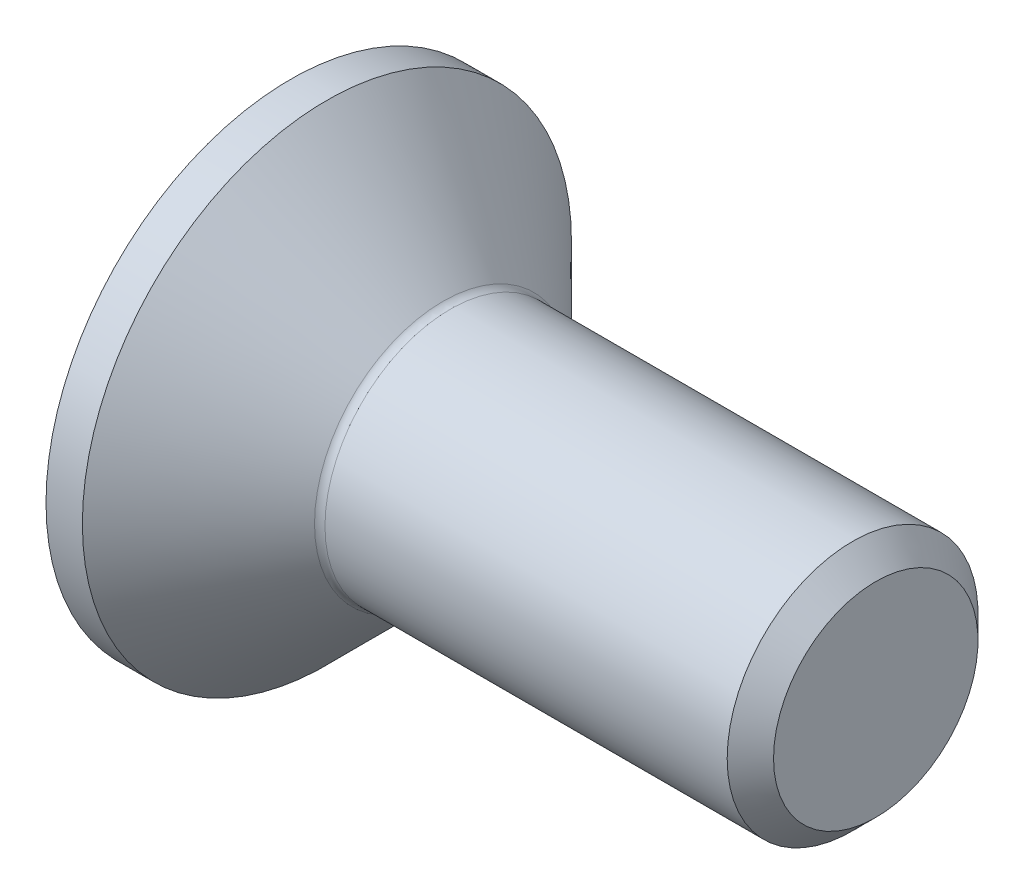
ISO-10303-21;
HEADER;
FILE_DESCRIPTION(('STEP AP214'),'2;1');
FILE_NAME('part.step','',(''),(''),'','','');
FILE_SCHEMA(('AUTOMOTIVE_DESIGN { 1 0 10303 214 1 1 1 1 }'));
ENDSEC;
DATA;
#1=APPLICATION_CONTEXT('core data for automotive mechanical design processes');
#2=APPLICATION_PROTOCOL_DEFINITION('international standard','automotive_design',2000,#1);
#3=PRODUCT_CONTEXT('',#1,'mechanical');
#4=PRODUCT('Part','Part','',(#3));
#5=PRODUCT_RELATED_PRODUCT_CATEGORY('part','',(#4));
#6=PRODUCT_DEFINITION_FORMATION('','',#4);
#7=PRODUCT_DEFINITION_CONTEXT('part definition',#1,'design');
#8=PRODUCT_DEFINITION('design','',#6,#7);
#9=PRODUCT_DEFINITION_SHAPE('','',#8);
#10=(LENGTH_UNIT() NAMED_UNIT(*) SI_UNIT(.MILLI.,.METRE.));
#11=(NAMED_UNIT(*) PLANE_ANGLE_UNIT() SI_UNIT($,.RADIAN.));
#12=(NAMED_UNIT(*) SI_UNIT($,.STERADIAN.) SOLID_ANGLE_UNIT());
#13=UNCERTAINTY_MEASURE_WITH_UNIT(LENGTH_MEASURE(1.E-05),#10,'distance_accuracy_value','');
#14=(GEOMETRIC_REPRESENTATION_CONTEXT(3) GLOBAL_UNCERTAINTY_ASSIGNED_CONTEXT((#13)) GLOBAL_UNIT_ASSIGNED_CONTEXT((#10,
#11,#12)) REPRESENTATION_CONTEXT('',''));
#15=CARTESIAN_POINT('',(0.,0.,0.));
#16=DIRECTION('',(0.,0.,1.));
#17=DIRECTION('',(1.,0.,0.));
#18=AXIS2_PLACEMENT_3D('',#15,#16,#17);
#19=CARTESIAN_POINT('',(0.,0.,0.));
#20=DIRECTION('',(-1.,0.,0.));
#21=DIRECTION('',(0.,0.,1.));
#22=AXIS2_PLACEMENT_3D('',#19,#20,#21);
#23=PLANE('',#22);
#24=CARTESIAN_POINT('',(0.,0.,0.));
#25=DIRECTION('',(-1.,0.,0.));
#26=DIRECTION('',(0.,0.,1.));
#27=AXIS2_PLACEMENT_3D('',#24,#25,#26);
#28=CIRCLE('',#27,5.85);
#29=CARTESIAN_POINT('',(0.,0.,5.85));
#30=VERTEX_POINT('',#29);
#31=EDGE_CURVE('E158',#30,#30,#28,.T.);
#32=ORIENTED_EDGE('',*,*,#31,.T.);
#33=EDGE_LOOP('',(#32));
#34=FACE_BOUND('',#33,.T.);
#35=DIRECTION('',(0.,-0.500000000000001,-0.866025403784438));
#36=VECTOR('',#35,1.);
#37=CARTESIAN_POINT('',(0.,-1.15470053837925,2.));
#38=LINE('',#37,#36);
#39=CARTESIAN_POINT('',(0.,-1.15470053837925,2.));
#40=VERTEX_POINT('',#39);
#41=CARTESIAN_POINT('',(0.,-2.3094010767585,0.));
#42=VERTEX_POINT('',#41);
#43=EDGE_CURVE('E120',#40,#42,#38,.T.);
#44=ORIENTED_EDGE('',*,*,#43,.T.);
#45=DIRECTION('',(0.,0.500000000000001,-0.866025403784438));
#46=VECTOR('',#45,1.);
#47=CARTESIAN_POINT('',(0.,-2.3094010767585,0.));
#48=LINE('',#47,#46);
#49=CARTESIAN_POINT('',(0.,-1.15470053837925,-2.));
#50=VERTEX_POINT('',#49);
#51=EDGE_CURVE('E50',#42,#50,#48,.T.);
#52=ORIENTED_EDGE('',*,*,#51,.T.);
#53=DIRECTION('',(0.,1.,0.));
#54=VECTOR('',#53,1.);
#55=CARTESIAN_POINT('',(0.,-1.15470053837925,-2.));
#56=LINE('',#55,#54);
#57=CARTESIAN_POINT('',(0.,1.15470053837925,-2.));
#58=VERTEX_POINT('',#57);
#59=EDGE_CURVE('E135',#50,#58,#56,.T.);
#60=ORIENTED_EDGE('',*,*,#59,.T.);
#61=DIRECTION('',(0.,0.5,0.866025403784438));
#62=VECTOR('',#61,1.);
#63=CARTESIAN_POINT('',(0.,1.15470053837925,-2.));
#64=LINE('',#63,#62);
#65=CARTESIAN_POINT('',(0.,2.3094010767585,0.));
#66=VERTEX_POINT('',#65);
#67=EDGE_CURVE('E271',#58,#66,#64,.T.);
#68=ORIENTED_EDGE('',*,*,#67,.T.);
#69=DIRECTION('',(0.,-0.5,0.866025403784439));
#70=VECTOR('',#69,1.);
#71=CARTESIAN_POINT('',(0.,2.3094010767585,0.));
#72=LINE('',#71,#70);
#73=CARTESIAN_POINT('',(0.,1.15470053837925,2.));
#74=VERTEX_POINT('',#73);
#75=EDGE_CURVE('E274',#66,#74,#72,.T.);
#76=ORIENTED_EDGE('',*,*,#75,.T.);
#77=DIRECTION('',(0.,-1.,0.));
#78=VECTOR('',#77,1.);
#79=CARTESIAN_POINT('',(0.,1.15470053837925,2.));
#80=LINE('',#79,#78);
#81=EDGE_CURVE('E277',#74,#40,#80,.T.);
#82=ORIENTED_EDGE('',*,*,#81,.T.);
#83=EDGE_LOOP('',(#44,#52,#60,#68,#76,#82));
#84=FACE_BOUND('',#83,.T.);
#85=ADVANCED_FACE('F35',(#34,#84),#23,.T.);
#86=CARTESIAN_POINT('',(0.,0.,0.));
#87=DIRECTION('',(-1.,0.,0.));
#88=DIRECTION('',(0.,0.,1.));
#89=AXIS2_PLACEMENT_3D('',#86,#87,#88);
#90=CYLINDRICAL_SURFACE('',#89,5.85);
#91=CARTESIAN_POINT('',(0.870000000000014,0.,0.));
#92=DIRECTION('',(-1.,0.,0.));
#93=DIRECTION('',(0.,0.,1.));
#94=AXIS2_PLACEMENT_3D('',#91,#92,#93);
#95=CIRCLE('',#94,5.85);
#96=CARTESIAN_POINT('',(0.870000000000014,0.,5.85));
#97=VERTEX_POINT('',#96);
#98=EDGE_CURVE('E155',#97,#97,#95,.T.);
#99=ORIENTED_EDGE('',*,*,#98,.T.);
#100=EDGE_LOOP('',(#99));
#101=FACE_BOUND('',#100,.T.);
#102=ORIENTED_EDGE('',*,*,#31,.F.);
#103=EDGE_LOOP('',(#102));
#104=FACE_BOUND('',#103,.T.);
#105=ADVANCED_FACE('F179',(#101,#104),#90,.T.);
#106=CARTESIAN_POINT('',(0.870000000000014,0.,0.));
#107=DIRECTION('',(-1.,0.,0.));
#108=DIRECTION('',(0.,0.,1.));
#109=AXIS2_PLACEMENT_3D('',#106,#107,#108);
#110=CONICAL_SURFACE('',#109,5.85,0.78539816339745);
#111=CARTESIAN_POINT('',(3.64677669529669,0.,0.));
#112=DIRECTION('',(-1.,0.,0.));
#113=DIRECTION('',(0.,0.,1.));
#114=AXIS2_PLACEMENT_3D('',#111,#112,#113);
#115=CIRCLE('',#114,3.07322330470331);
#116=CARTESIAN_POINT('',(3.64677669529669,0.,3.07322330470331));
#117=VERTEX_POINT('',#116);
#118=EDGE_CURVE('E43',#117,#117,#115,.T.);
#119=ORIENTED_EDGE('',*,*,#118,.T.);
#120=EDGE_LOOP('',(#119));
#121=FACE_BOUND('',#120,.T.);
#122=ORIENTED_EDGE('',*,*,#98,.F.);
#123=EDGE_LOOP('',(#122));
#124=FACE_BOUND('',#123,.T.);
#125=ADVANCED_FACE('F163',(#121,#124),#110,.T.);
#126=CARTESIAN_POINT('',(0.,0.,0.));
#127=DIRECTION('',(-1.,0.,0.));
#128=DIRECTION('',(0.,0.,1.));
#129=AXIS2_PLACEMENT_3D('',#126,#127,#128);
#130=CYLINDRICAL_SURFACE('',#129,2.99999999999995);
#131=CARTESIAN_POINT('',(3.82355339059333,0.,0.));
#132=DIRECTION('',(-1.,0.,0.));
#133=DIRECTION('',(0.,0.,1.));
#134=AXIS2_PLACEMENT_3D('',#131,#132,#133);
#135=CIRCLE('',#134,2.99999999999995);
#136=CARTESIAN_POINT('',(3.82355339059333,0.,2.99999999999995));
#137=VERTEX_POINT('',#136);
#138=EDGE_CURVE('E11',#137,#137,#135,.F.);
#139=ORIENTED_EDGE('',*,*,#138,.T.);
#140=EDGE_LOOP('',(#139));
#141=FACE_BOUND('',#140,.T.);
#142=CARTESIAN_POINT('',(13.4454999999999,0.,0.));
#143=DIRECTION('',(-1.,0.,0.));
#144=DIRECTION('',(0.,0.,1.));
#145=AXIS2_PLACEMENT_3D('',#142,#143,#144);
#146=CIRCLE('',#145,2.99999999999989);
#147=CARTESIAN_POINT('',(13.4454999999999,0.,2.99999999999989));
#148=VERTEX_POINT('',#147);
#149=EDGE_CURVE('E152',#148,#148,#146,.T.);
#150=ORIENTED_EDGE('',*,*,#149,.T.);
#151=EDGE_LOOP('',(#150));
#152=FACE_BOUND('',#151,.T.);
#153=ADVANCED_FACE('F190',(#141,#152),#130,.T.);
#154=CARTESIAN_POINT('',(14.,0.,0.));
#155=DIRECTION('',(-1.,0.,0.));
#156=DIRECTION('',(0.,0.,1.));
#157=AXIS2_PLACEMENT_3D('',#154,#155,#156);
#158=CONICAL_SURFACE('',#157,2.4455,0.785398163397268);
#159=ORIENTED_EDGE('',*,*,#149,.F.);
#160=EDGE_LOOP('',(#159));
#161=FACE_BOUND('',#160,.T.);
#162=CARTESIAN_POINT('',(14.,0.,0.));
#163=DIRECTION('',(-1.,0.,0.));
#164=DIRECTION('',(0.,0.,1.));
#165=AXIS2_PLACEMENT_3D('',#162,#163,#164);
#166=CIRCLE('',#165,2.4455);
#167=CARTESIAN_POINT('',(14.,0.,2.4455));
#168=VERTEX_POINT('',#167);
#169=EDGE_CURVE('E148',#168,#168,#166,.T.);
#170=ORIENTED_EDGE('',*,*,#169,.T.);
#171=EDGE_LOOP('',(#170));
#172=FACE_BOUND('',#171,.T.);
#173=ADVANCED_FACE('F174',(#161,#172),#158,.T.);
#174=CARTESIAN_POINT('',(14.,2.4455,0.));
#175=DIRECTION('',(1.,0.,0.));
#176=DIRECTION('',(0.,0.,-1.));
#177=AXIS2_PLACEMENT_3D('',#174,#175,#176);
#178=PLANE('',#177);
#179=ORIENTED_EDGE('',*,*,#169,.F.);
#180=EDGE_LOOP('',(#179));
#181=FACE_BOUND('',#180,.T.);
#182=ADVANCED_FACE('F167',(#181),#178,.T.);
#183=CARTESIAN_POINT('',(3.82355339059333,0.,0.));
#184=DIRECTION('',(-1.,0.,0.));
#185=DIRECTION('',(0.,0.,1.));
#186=AXIS2_PLACEMENT_3D('',#183,#184,#185);
#187=TOROIDAL_SURFACE('',#186,3.24999999999995,0.25);
#188=ORIENTED_EDGE('',*,*,#138,.F.);
#189=EDGE_LOOP('',(#188));
#190=FACE_BOUND('',#189,.T.);
#191=ORIENTED_EDGE('',*,*,#118,.F.);
#192=EDGE_LOOP('',(#191));
#193=FACE_BOUND('',#192,.T.);
#194=ADVANCED_FACE('F37',(#190,#193),#187,.F.);
#195=CARTESIAN_POINT('',(2.2,-2.3094010767585,0.));
#196=DIRECTION('',(0.,0.866025403784438,0.500000000000001));
#197=DIRECTION('',(0.,-0.500000000000001,0.866025403784438));
#198=AXIS2_PLACEMENT_3D('',#195,#196,#197);
#199=PLANE('',#198);
#200=ORIENTED_EDGE('',*,*,#51,.F.);
#201=DIRECTION('',(-1.,0.,0.));
#202=VECTOR('',#201,1.);
#203=CARTESIAN_POINT('',(2.2,-2.3094010767585,0.));
#204=LINE('',#203,#202);
#205=CARTESIAN_POINT('',(2.2,-2.3094010767585,0.));
#206=VERTEX_POINT('',#205);
#207=EDGE_CURVE('E268',#206,#42,#204,.T.);
#208=ORIENTED_EDGE('',*,*,#207,.F.);
#209=DIRECTION('',(0.,0.500000000000001,-0.866025403784438));
#210=VECTOR('',#209,1.);
#211=CARTESIAN_POINT('',(2.2,-2.3094010767585,0.));
#212=LINE('',#211,#210);
#213=CARTESIAN_POINT('',(2.2,-1.73205080756888,-1.));
#214=VERTEX_POINT('',#213);
#215=EDGE_CURVE('E117',#206,#214,#212,.T.);
#216=ORIENTED_EDGE('',*,*,#215,.T.);
#217=CARTESIAN_POINT('',(2.2,-1.15470053837925,-2.));
#218=VERTEX_POINT('',#217);
#219=EDGE_CURVE('E111',#214,#218,#212,.T.);
#220=ORIENTED_EDGE('',*,*,#219,.T.);
#221=DIRECTION('',(-1.,0.,0.));
#222=VECTOR('',#221,1.);
#223=CARTESIAN_POINT('',(2.2,-1.15470053837925,-2.));
#224=LINE('',#223,#222);
#225=EDGE_CURVE('E115',#218,#50,#224,.T.);
#226=ORIENTED_EDGE('',*,*,#225,.T.);
#227=EDGE_LOOP('',(#200,#208,#216,#220,#226));
#228=FACE_BOUND('',#227,.T.);
#229=ADVANCED_FACE('F113',(#228),#199,.T.);
#230=CARTESIAN_POINT('',(2.2,-1.15470053837925,-2.));
#231=DIRECTION('',(0.,0.,1.));
#232=DIRECTION('',(1.,0.,0.));
#233=AXIS2_PLACEMENT_3D('',#230,#231,#232);
#234=PLANE('',#233);
#235=ORIENTED_EDGE('',*,*,#59,.F.);
#236=ORIENTED_EDGE('',*,*,#225,.F.);
#237=DIRECTION('',(0.,1.,0.));
#238=VECTOR('',#237,1.);
#239=CARTESIAN_POINT('',(2.2,-1.15470053837925,-2.));
#240=LINE('',#239,#238);
#241=CARTESIAN_POINT('',(2.2,0.,-2.));
#242=VERTEX_POINT('',#241);
#243=EDGE_CURVE('E123',#218,#242,#240,.T.);
#244=ORIENTED_EDGE('',*,*,#243,.T.);
#245=CARTESIAN_POINT('',(2.2,1.15470053837925,-2.));
#246=VERTEX_POINT('',#245);
#247=EDGE_CURVE('E130',#242,#246,#240,.T.);
#248=ORIENTED_EDGE('',*,*,#247,.T.);
#249=DIRECTION('',(-1.,0.,0.));
#250=VECTOR('',#249,1.);
#251=CARTESIAN_POINT('',(2.2,1.15470053837925,-2.));
#252=LINE('',#251,#250);
#253=EDGE_CURVE('E137',#246,#58,#252,.T.);
#254=ORIENTED_EDGE('',*,*,#253,.T.);
#255=EDGE_LOOP('',(#235,#236,#244,#248,#254));
#256=FACE_BOUND('',#255,.T.);
#257=ADVANCED_FACE('F132',(#256),#234,.T.);
#258=CARTESIAN_POINT('',(2.2,1.15470053837925,-2.));
#259=DIRECTION('',(0.,-0.866025403784439,0.5));
#260=DIRECTION('',(0.,-0.5,-0.866025403784439));
#261=AXIS2_PLACEMENT_3D('',#258,#259,#260);
#262=PLANE('',#261);
#263=ORIENTED_EDGE('',*,*,#67,.F.);
#264=ORIENTED_EDGE('',*,*,#253,.F.);
#265=DIRECTION('',(0.,0.5,0.866025403784438));
#266=VECTOR('',#265,1.);
#267=CARTESIAN_POINT('',(2.2,1.15470053837925,-2.));
#268=LINE('',#267,#266);
#269=CARTESIAN_POINT('',(2.2,1.73205080756888,-1.));
#270=VERTEX_POINT('',#269);
#271=EDGE_CURVE('E260',#246,#270,#268,.T.);
#272=ORIENTED_EDGE('',*,*,#271,.T.);
#273=CARTESIAN_POINT('',(2.2,2.3094010767585,0.));
#274=VERTEX_POINT('',#273);
#275=EDGE_CURVE('E129',#270,#274,#268,.T.);
#276=ORIENTED_EDGE('',*,*,#275,.T.);
#277=DIRECTION('',(-1.,0.,0.));
#278=VECTOR('',#277,1.);
#279=CARTESIAN_POINT('',(2.2,2.3094010767585,0.));
#280=LINE('',#279,#278);
#281=EDGE_CURVE('E143',#274,#66,#280,.T.);
#282=ORIENTED_EDGE('',*,*,#281,.T.);
#283=EDGE_LOOP('',(#263,#264,#272,#276,#282));
#284=FACE_BOUND('',#283,.T.);
#285=ADVANCED_FACE('F204',(#284),#262,.T.);
#286=CARTESIAN_POINT('',(2.2,2.3094010767585,0.));
#287=DIRECTION('',(0.,-0.866025403784439,-0.5));
#288=DIRECTION('',(0.,0.5,-0.866025403784439));
#289=AXIS2_PLACEMENT_3D('',#286,#287,#288);
#290=PLANE('',#289);
#291=ORIENTED_EDGE('',*,*,#75,.F.);
#292=ORIENTED_EDGE('',*,*,#281,.F.);
#293=DIRECTION('',(0.,-0.5,0.866025403784439));
#294=VECTOR('',#293,1.);
#295=CARTESIAN_POINT('',(2.2,2.3094010767585,0.));
#296=LINE('',#295,#294);
#297=CARTESIAN_POINT('',(2.2,1.73205080756888,1.));
#298=VERTEX_POINT('',#297);
#299=EDGE_CURVE('E58',#274,#298,#296,.T.);
#300=ORIENTED_EDGE('',*,*,#299,.T.);
#301=CARTESIAN_POINT('',(2.2,1.15470053837925,2.));
#302=VERTEX_POINT('',#301);
#303=EDGE_CURVE('E239',#298,#302,#296,.T.);
#304=ORIENTED_EDGE('',*,*,#303,.T.);
#305=DIRECTION('',(-1.,0.,0.));
#306=VECTOR('',#305,1.);
#307=CARTESIAN_POINT('',(2.2,1.15470053837925,2.));
#308=LINE('',#307,#306);
#309=EDGE_CURVE('E253',#302,#74,#308,.T.);
#310=ORIENTED_EDGE('',*,*,#309,.T.);
#311=EDGE_LOOP('',(#291,#292,#300,#304,#310));
#312=FACE_BOUND('',#311,.T.);
#313=ADVANCED_FACE('F207',(#312),#290,.T.);
#314=CARTESIAN_POINT('',(2.2,1.15470053837925,2.));
#315=DIRECTION('',(0.,0.,-1.));
#316=DIRECTION('',(-1.,0.,0.));
#317=AXIS2_PLACEMENT_3D('',#314,#315,#316);
#318=PLANE('',#317);
#319=ORIENTED_EDGE('',*,*,#81,.F.);
#320=ORIENTED_EDGE('',*,*,#309,.F.);
#321=DIRECTION('',(0.,-1.,0.));
#322=VECTOR('',#321,1.);
#323=CARTESIAN_POINT('',(2.2,1.15470053837925,2.));
#324=LINE('',#323,#322);
#325=CARTESIAN_POINT('',(2.2,0.,2.));
#326=VERTEX_POINT('',#325);
#327=EDGE_CURVE('E238',#302,#326,#324,.T.);
#328=ORIENTED_EDGE('',*,*,#327,.T.);
#329=CARTESIAN_POINT('',(2.2,-1.15470053837925,2.));
#330=VERTEX_POINT('',#329);
#331=EDGE_CURVE('E244',#326,#330,#324,.T.);
#332=ORIENTED_EDGE('',*,*,#331,.T.);
#333=DIRECTION('',(-1.,0.,0.));
#334=VECTOR('',#333,1.);
#335=CARTESIAN_POINT('',(2.2,-1.15470053837925,2.));
#336=LINE('',#335,#334);
#337=EDGE_CURVE('E283',#330,#40,#336,.T.);
#338=ORIENTED_EDGE('',*,*,#337,.T.);
#339=EDGE_LOOP('',(#319,#320,#328,#332,#338));
#340=FACE_BOUND('',#339,.T.);
#341=ADVANCED_FACE('F211',(#340),#318,.T.);
#342=CARTESIAN_POINT('',(2.2,-1.15470053837925,2.));
#343=DIRECTION('',(0.,0.866025403784438,-0.500000000000001));
#344=DIRECTION('',(0.,0.500000000000002,0.866025403784438));
#345=AXIS2_PLACEMENT_3D('',#342,#343,#344);
#346=PLANE('',#345);
#347=ORIENTED_EDGE('',*,*,#43,.F.);
#348=ORIENTED_EDGE('',*,*,#337,.F.);
#349=DIRECTION('',(0.,-0.500000000000001,-0.866025403784438));
#350=VECTOR('',#349,1.);
#351=CARTESIAN_POINT('',(2.2,-1.15470053837925,2.));
#352=LINE('',#351,#350);
#353=CARTESIAN_POINT('',(2.2,-1.73205080756888,1.));
#354=VERTEX_POINT('',#353);
#355=EDGE_CURVE('E247',#330,#354,#352,.T.);
#356=ORIENTED_EDGE('',*,*,#355,.T.);
#357=EDGE_CURVE('E254',#354,#206,#352,.T.);
#358=ORIENTED_EDGE('',*,*,#357,.T.);
#359=ORIENTED_EDGE('',*,*,#207,.T.);
#360=EDGE_LOOP('',(#347,#348,#356,#358,#359));
#361=FACE_BOUND('',#360,.T.);
#362=ADVANCED_FACE('F214',(#361),#346,.T.);
#363=CARTESIAN_POINT('',(2.2,-2.3094010767585,0.));
#364=DIRECTION('',(-1.,0.,0.));
#365=DIRECTION('',(0.,0.,1.));
#366=AXIS2_PLACEMENT_3D('',#363,#364,#365);
#367=PLANE('',#366);
#368=CARTESIAN_POINT('',(2.2,0.,0.));
#369=DIRECTION('',(-1.,0.,0.));
#370=DIRECTION('',(0.,0.,1.));
#371=AXIS2_PLACEMENT_3D('',#368,#369,#370);
#372=CIRCLE('',#371,2.);
#373=EDGE_CURVE('E136',#354,#326,#372,.T.);
#374=ORIENTED_EDGE('',*,*,#373,.F.);
#375=ORIENTED_EDGE('',*,*,#355,.F.);
#376=ORIENTED_EDGE('',*,*,#331,.F.);
#377=EDGE_LOOP('',(#374,#375,#376));
#378=FACE_BOUND('',#377,.T.);
#379=ADVANCED_FACE('F218',(#378),#367,.T.);
#380=EDGE_CURVE('E140',#214,#354,#372,.T.);
#381=ORIENTED_EDGE('',*,*,#380,.F.);
#382=ORIENTED_EDGE('',*,*,#215,.F.);
#383=ORIENTED_EDGE('',*,*,#357,.F.);
#384=EDGE_LOOP('',(#381,#382,#383));
#385=FACE_BOUND('',#384,.T.);
#386=ADVANCED_FACE('F221',(#385),#367,.T.);
#387=EDGE_CURVE('E125',#242,#214,#372,.T.);
#388=ORIENTED_EDGE('',*,*,#387,.F.);
#389=ORIENTED_EDGE('',*,*,#243,.F.);
#390=ORIENTED_EDGE('',*,*,#219,.F.);
#391=EDGE_LOOP('',(#388,#389,#390));
#392=FACE_BOUND('',#391,.T.);
#393=ADVANCED_FACE('F124',(#392),#367,.T.);
#394=EDGE_CURVE('E256',#270,#242,#372,.T.);
#395=ORIENTED_EDGE('',*,*,#394,.F.);
#396=ORIENTED_EDGE('',*,*,#271,.F.);
#397=ORIENTED_EDGE('',*,*,#247,.F.);
#398=EDGE_LOOP('',(#395,#396,#397));
#399=FACE_BOUND('',#398,.T.);
#400=ADVANCED_FACE('F233',(#399),#367,.T.);
#401=EDGE_CURVE('E149',#298,#270,#372,.T.);
#402=ORIENTED_EDGE('',*,*,#401,.F.);
#403=ORIENTED_EDGE('',*,*,#299,.F.);
#404=ORIENTED_EDGE('',*,*,#275,.F.);
#405=EDGE_LOOP('',(#402,#403,#404));
#406=FACE_BOUND('',#405,.T.);
#407=ADVANCED_FACE('F228',(#406),#367,.T.);
#408=EDGE_CURVE('E142',#326,#298,#372,.T.);
#409=ORIENTED_EDGE('',*,*,#408,.F.);
#410=ORIENTED_EDGE('',*,*,#327,.F.);
#411=ORIENTED_EDGE('',*,*,#303,.F.);
#412=EDGE_LOOP('',(#409,#410,#411));
#413=FACE_BOUND('',#412,.T.);
#414=ADVANCED_FACE('F199',(#413),#367,.T.);
#415=CARTESIAN_POINT('',(2.2,0.,0.));
#416=DIRECTION('',(-1.,0.,0.));
#417=DIRECTION('',(0.,0.,1.));
#418=AXIS2_PLACEMENT_3D('',#415,#416,#417);
#419=CONICAL_SURFACE('',#418,2.,1.04719755119659);
#420=CARTESIAN_POINT('',(3.35470053837926,0.,0.));
#421=VERTEX_POINT('',#420);
#422=VERTEX_LOOP('',#421);
#423=FACE_BOUND('',#422,.T.);
#424=ORIENTED_EDGE('',*,*,#408,.T.);
#425=ORIENTED_EDGE('',*,*,#401,.T.);
#426=ORIENTED_EDGE('',*,*,#394,.T.);
#427=ORIENTED_EDGE('',*,*,#387,.T.);
#428=ORIENTED_EDGE('',*,*,#380,.T.);
#429=ORIENTED_EDGE('',*,*,#373,.T.);
#430=EDGE_LOOP('',(#424,#425,#426,#427,#428,#429));
#431=FACE_BOUND('',#430,.T.);
#432=ADVANCED_FACE('F197',(#423,#431),#419,.F.);
#433=CLOSED_SHELL('',(#85,#105,#125,#153,#173,#182,#194,#229,#257,#285,#313,#341,#362,#379,#386,
#393,#400,#407,#414,#432));
#434=MANIFOLD_SOLID_BREP('B2',#433);
#435=ADVANCED_BREP_SHAPE_REPRESENTATION('',(#18,#434),#14);
#436=SHAPE_DEFINITION_REPRESENTATION(#9,#435);
ENDSEC;
END-ISO-10303-21;
